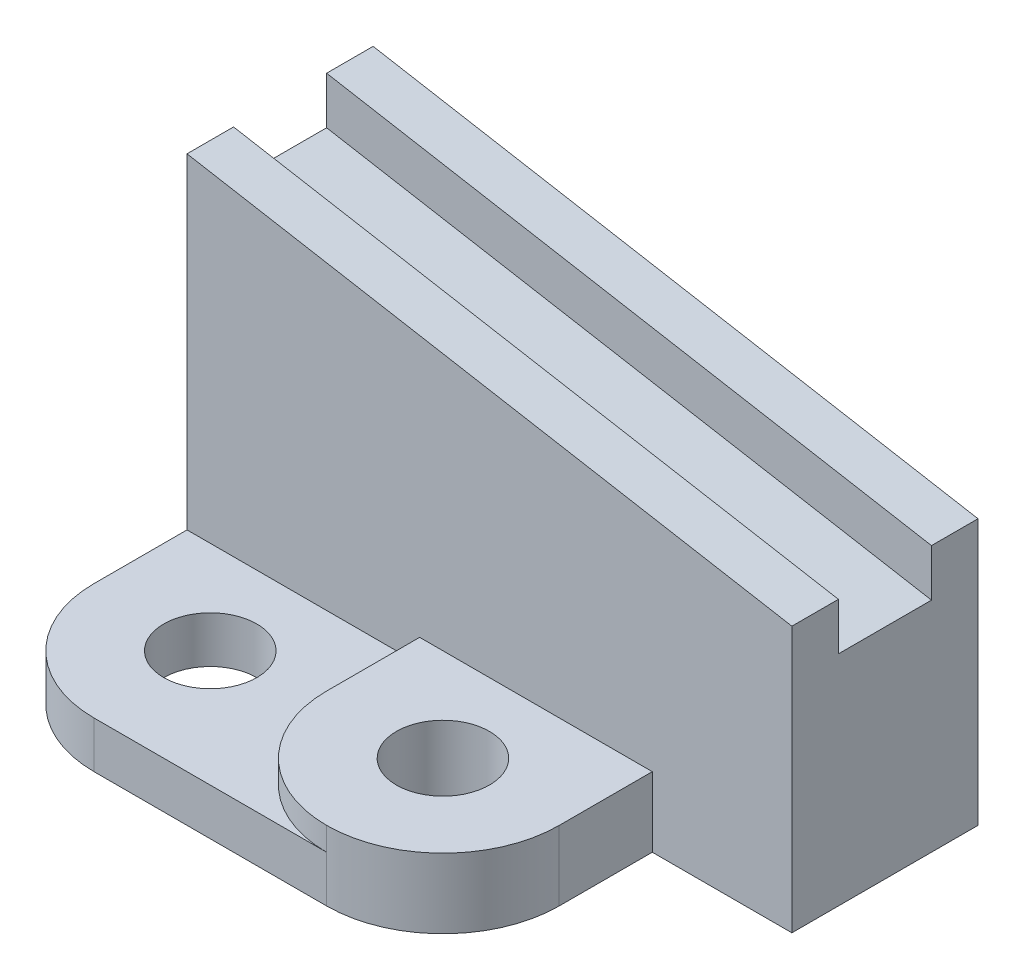
ISO-10303-21;
HEADER;
FILE_DESCRIPTION(('STEP AP214'),'2;1');
FILE_NAME('part.step','',(''),(''),'','','');
FILE_SCHEMA(('AUTOMOTIVE_DESIGN { 1 0 10303 214 1 1 1 1 }'));
ENDSEC;
DATA;
#1=APPLICATION_CONTEXT('core data for automotive mechanical design processes');
#2=APPLICATION_PROTOCOL_DEFINITION('international standard','automotive_design',2000,#1);
#3=PRODUCT_CONTEXT('',#1,'mechanical');
#4=PRODUCT('Part','Part','',(#3));
#5=PRODUCT_RELATED_PRODUCT_CATEGORY('part','',(#4));
#6=PRODUCT_DEFINITION_FORMATION('','',#4);
#7=PRODUCT_DEFINITION_CONTEXT('part definition',#1,'design');
#8=PRODUCT_DEFINITION('design','',#6,#7);
#9=PRODUCT_DEFINITION_SHAPE('','',#8);
#10=(LENGTH_UNIT() NAMED_UNIT(*) SI_UNIT(.MILLI.,.METRE.));
#11=(NAMED_UNIT(*) PLANE_ANGLE_UNIT() SI_UNIT($,.RADIAN.));
#12=(NAMED_UNIT(*) SI_UNIT($,.STERADIAN.) SOLID_ANGLE_UNIT());
#13=UNCERTAINTY_MEASURE_WITH_UNIT(LENGTH_MEASURE(1.E-05),#10,'distance_accuracy_value','');
#14=(GEOMETRIC_REPRESENTATION_CONTEXT(3) GLOBAL_UNCERTAINTY_ASSIGNED_CONTEXT((#13)) GLOBAL_UNIT_ASSIGNED_CONTEXT((#10,
#11,#12)) REPRESENTATION_CONTEXT('',''));
#15=CARTESIAN_POINT('',(0.,0.,0.));
#16=DIRECTION('',(0.,0.,1.));
#17=DIRECTION('',(1.,0.,0.));
#18=AXIS2_PLACEMENT_3D('',#15,#16,#17);
#19=CARTESIAN_POINT('',(-28.2953241603486,9.30078056478405,60.));
#20=DIRECTION('',(0.,1.,0.));
#21=DIRECTION('',(0.,0.,1.));
#22=AXIS2_PLACEMENT_3D('',#19,#20,#21);
#23=CYLINDRICAL_SURFACE('',#22,10.);
#24=CARTESIAN_POINT('',(-28.2953241603486,9.30083056478405,60.));
#25=DIRECTION('',(0.,1.,0.));
#26=DIRECTION('',(0.,0.,1.));
#27=AXIS2_PLACEMENT_3D('',#24,#25,#26);
#28=CIRCLE('',#27,10.);
#29=CARTESIAN_POINT('',(-28.2953241603486,9.30083056478405,70.));
#30=VERTEX_POINT('',#29);
#31=EDGE_CURVE('E176',#30,#30,#28,.T.);
#32=ORIENTED_EDGE('',*,*,#31,.F.);
#33=EDGE_LOOP('',(#32));
#34=FACE_BOUND('',#33,.T.);
#35=CARTESIAN_POINT('',(-28.2953241603486,19.300830564784,60.));
#36=DIRECTION('',(0.,1.,0.));
#37=DIRECTION('',(0.,0.,1.));
#38=AXIS2_PLACEMENT_3D('',#35,#36,#37);
#39=CIRCLE('',#38,10.);
#40=CARTESIAN_POINT('',(-28.2953241603486,19.300830564784,70.));
#41=VERTEX_POINT('',#40);
#42=EDGE_CURVE('E158',#41,#41,#39,.F.);
#43=ORIENTED_EDGE('',*,*,#42,.F.);
#44=EDGE_LOOP('',(#43));
#45=FACE_BOUND('',#44,.T.);
#46=ADVANCED_FACE('F35',(#34,#45),#23,.F.);
#47=CARTESIAN_POINT('',(-28.2953241603486,9.30083056478405,60.));
#48=DIRECTION('',(0.,1.,0.));
#49=DIRECTION('',(0.,0.,1.));
#50=AXIS2_PLACEMENT_3D('',#47,#48,#49);
#51=CYLINDRICAL_SURFACE('',#50,25.);
#52=DIRECTION('',(0.,1.,0.));
#53=VECTOR('',#52,1.);
#54=CARTESIAN_POINT('',(-28.2953241603486,0.,85.));
#55=LINE('',#54,#53);
#56=CARTESIAN_POINT('',(-28.2953241603486,19.300830564784,85.));
#57=VERTEX_POINT('',#56);
#58=CARTESIAN_POINT('',(-28.2953241603486,9.30083056478405,85.));
#59=VERTEX_POINT('',#58);
#60=EDGE_CURVE('E230',#57,#59,#55,.F.);
#61=ORIENTED_EDGE('',*,*,#60,.F.);
#62=CARTESIAN_POINT('',(-28.2953241603486,19.300830564784,60.));
#63=DIRECTION('',(0.,1.,0.));
#64=DIRECTION('',(0.,0.,1.));
#65=AXIS2_PLACEMENT_3D('',#62,#63,#64);
#66=CIRCLE('',#65,25.);
#67=CARTESIAN_POINT('',(-53.2953241603486,19.300830564784,60.));
#68=VERTEX_POINT('',#67);
#69=EDGE_CURVE('E190',#57,#68,#66,.F.);
#70=ORIENTED_EDGE('',*,*,#69,.T.);
#71=DIRECTION('',(0.,1.,0.));
#72=VECTOR('',#71,1.);
#73=CARTESIAN_POINT('',(-53.2953241603486,9.30083056478405,60.));
#74=LINE('',#73,#72);
#75=CARTESIAN_POINT('',(-53.2953241603486,9.30083056478405,60.));
#76=VERTEX_POINT('',#75);
#77=EDGE_CURVE('E227',#76,#68,#74,.T.);
#78=ORIENTED_EDGE('',*,*,#77,.F.);
#79=CARTESIAN_POINT('',(-28.2953241603486,9.30083056478405,60.));
#80=DIRECTION('',(0.,1.,0.));
#81=DIRECTION('',(0.,0.,1.));
#82=AXIS2_PLACEMENT_3D('',#79,#80,#81);
#83=CIRCLE('',#82,25.);
#84=EDGE_CURVE('E231',#59,#76,#83,.F.);
#85=ORIENTED_EDGE('',*,*,#84,.F.);
#86=EDGE_LOOP('',(#61,#70,#78,#85));
#87=FACE_BOUND('',#86,.T.);
#88=ADVANCED_FACE('F240',(#87),#51,.T.);
#89=CARTESIAN_POINT('',(-53.2953241603486,89.3008305647841,40.));
#90=DIRECTION('',(-0.173648177666934,-0.984807753012207,0.));
#91=DIRECTION('',(0.984807753012207,-0.173648177666934,0.));
#92=AXIS2_PLACEMENT_3D('',#89,#90,#91);
#93=PLANE('',#92);
#94=DIRECTION('',(0.,0.,-1.));
#95=VECTOR('',#94,1.);
#96=CARTESIAN_POINT('',(-53.2953241603486,89.3008305647841,40.));
#97=LINE('',#96,#95);
#98=CARTESIAN_POINT('',(-53.2953241603486,89.3008305647841,10.));
#99=VERTEX_POINT('',#98);
#100=CARTESIAN_POINT('',(-53.2953241603486,89.3008305647841,0.));
#101=VERTEX_POINT('',#100);
#102=EDGE_CURVE('E276',#99,#101,#97,.T.);
#103=ORIENTED_EDGE('',*,*,#102,.F.);
#104=DIRECTION('',(0.984807753012207,-0.173648177666934,0.));
#105=VECTOR('',#104,1.);
#106=CARTESIAN_POINT('',(-53.2953241603486,89.3008305647841,10.));
#107=LINE('',#106,#105);
#108=CARTESIAN_POINT('',(76.7046758396514,66.3783230726832,10.));
#109=VERTEX_POINT('',#108);
#110=EDGE_CURVE('E214',#99,#109,#107,.T.);
#111=ORIENTED_EDGE('',*,*,#110,.T.);
#112=DIRECTION('',(0.,0.,-1.));
#113=VECTOR('',#112,1.);
#114=CARTESIAN_POINT('',(76.7046758396514,66.3783230726831,40.));
#115=LINE('',#114,#113);
#116=CARTESIAN_POINT('',(76.7046758396514,66.3783230726831,0.));
#117=VERTEX_POINT('',#116);
#118=EDGE_CURVE('E287',#109,#117,#115,.T.);
#119=ORIENTED_EDGE('',*,*,#118,.T.);
#120=DIRECTION('',(-0.984807753012207,0.173648177666934,0.));
#121=VECTOR('',#120,1.);
#122=CARTESIAN_POINT('',(-53.2953241603486,89.3008305647841,0.));
#123=LINE('',#122,#121);
#124=EDGE_CURVE('E263',#117,#101,#123,.T.);
#125=ORIENTED_EDGE('',*,*,#124,.T.);
#126=EDGE_LOOP('',(#103,#111,#119,#125));
#127=FACE_BOUND('',#126,.T.);
#128=ADVANCED_FACE('F295',(#127),#93,.F.);
#129=CARTESIAN_POINT('',(-53.2953241603486,9.30083056478405,40.));
#130=DIRECTION('',(1.,0.,0.));
#131=DIRECTION('',(0.,0.,-1.));
#132=AXIS2_PLACEMENT_3D('',#129,#130,#131);
#133=PLANE('',#132);
#134=DIRECTION('',(0.,0.,1.));
#135=VECTOR('',#134,1.);
#136=CARTESIAN_POINT('',(-53.2953241603486,19.300830564784,40.));
#137=LINE('',#136,#135);
#138=CARTESIAN_POINT('',(-53.2953241603486,19.300830564784,40.));
#139=VERTEX_POINT('',#138);
#140=EDGE_CURVE('E166',#139,#68,#137,.T.);
#141=ORIENTED_EDGE('',*,*,#140,.F.);
#142=DIRECTION('',(0.,-1.,0.));
#143=VECTOR('',#142,1.);
#144=CARTESIAN_POINT('',(-53.2953241603486,9.30083056478405,40.));
#145=LINE('',#144,#143);
#146=CARTESIAN_POINT('',(-53.2953241603486,89.3008305647841,40.));
#147=VERTEX_POINT('',#146);
#148=EDGE_CURVE('E162',#147,#139,#145,.T.);
#149=ORIENTED_EDGE('',*,*,#148,.F.);
#150=CARTESIAN_POINT('',(-53.2953241603486,89.3008305647841,30.));
#151=VERTEX_POINT('',#150);
#152=EDGE_CURVE('E285',#147,#151,#97,.T.);
#153=ORIENTED_EDGE('',*,*,#152,.T.);
#154=DIRECTION('',(0.,-1.,0.));
#155=VECTOR('',#154,1.);
#156=CARTESIAN_POINT('',(-53.2953241603486,9.30083056478405,30.));
#157=LINE('',#156,#155);
#158=CARTESIAN_POINT('',(-53.2953241603486,79.1465644459266,30.));
#159=VERTEX_POINT('',#158);
#160=EDGE_CURVE('E523',#151,#159,#157,.T.);
#161=ORIENTED_EDGE('',*,*,#160,.T.);
#162=DIRECTION('',(0.,0.,1.));
#163=VECTOR('',#162,1.);
#164=CARTESIAN_POINT('',(-53.2953241603486,79.1465644459266,40.));
#165=LINE('',#164,#163);
#166=CARTESIAN_POINT('',(-53.2953241603486,79.1465644459266,10.));
#167=VERTEX_POINT('',#166);
#168=EDGE_CURVE('E268',#167,#159,#165,.T.);
#169=ORIENTED_EDGE('',*,*,#168,.F.);
#170=DIRECTION('',(0.,1.,0.));
#171=VECTOR('',#170,1.);
#172=CARTESIAN_POINT('',(-53.2953241603486,9.30083056478405,10.));
#173=LINE('',#172,#171);
#174=EDGE_CURVE('E522',#167,#99,#173,.T.);
#175=ORIENTED_EDGE('',*,*,#174,.T.);
#176=ORIENTED_EDGE('',*,*,#102,.T.);
#177=DIRECTION('',(0.,-1.,0.));
#178=VECTOR('',#177,1.);
#179=CARTESIAN_POINT('',(-53.2953241603486,9.30083056478405,0.));
#180=LINE('',#179,#178);
#181=CARTESIAN_POINT('',(-53.2953241603486,9.30083056478405,0.));
#182=VERTEX_POINT('',#181);
#183=EDGE_CURVE('E246',#101,#182,#180,.T.);
#184=ORIENTED_EDGE('',*,*,#183,.T.);
#185=DIRECTION('',(0.,0.,-1.));
#186=VECTOR('',#185,1.);
#187=CARTESIAN_POINT('',(-53.2953241603486,9.30083056478405,40.));
#188=LINE('',#187,#186);
#189=EDGE_CURVE('E244',#76,#182,#188,.T.);
#190=ORIENTED_EDGE('',*,*,#189,.F.);
#191=ORIENTED_EDGE('',*,*,#77,.T.);
#192=EDGE_LOOP('',(#141,#149,#153,#161,#169,#175,#176,#184,#190,#191));
#193=FACE_BOUND('',#192,.T.);
#194=ADVANCED_FACE('F242',(#193),#133,.F.);
#195=CARTESIAN_POINT('',(-53.2953241603486,9.30083056478405,40.));
#196=DIRECTION('',(0.,1.,0.));
#197=DIRECTION('',(0.,0.,1.));
#198=AXIS2_PLACEMENT_3D('',#195,#196,#197);
#199=PLANE('',#198);
#200=CARTESIAN_POINT('',(21.7046758396514,9.30083056478405,60.));
#201=DIRECTION('',(0.,1.,0.));
#202=DIRECTION('',(0.,0.,1.));
#203=AXIS2_PLACEMENT_3D('',#200,#201,#202);
#204=CIRCLE('',#203,10.);
#205=CARTESIAN_POINT('',(21.7046758396514,9.30083056478405,70.));
#206=VERTEX_POINT('',#205);
#207=EDGE_CURVE('E173',#206,#206,#204,.T.);
#208=ORIENTED_EDGE('',*,*,#207,.T.);
#209=EDGE_LOOP('',(#208));
#210=FACE_BOUND('',#209,.T.);
#211=ORIENTED_EDGE('',*,*,#31,.T.);
#212=EDGE_LOOP('',(#211));
#213=FACE_BOUND('',#212,.T.);
#214=DIRECTION('',(1.,0.,0.));
#215=VECTOR('',#214,1.);
#216=CARTESIAN_POINT('',(-53.2953241603486,9.30083056478405,85.));
#217=LINE('',#216,#215);
#218=CARTESIAN_POINT('',(21.7046758396514,9.30083056478405,85.));
#219=VERTEX_POINT('',#218);
#220=EDGE_CURVE('E180',#59,#219,#217,.T.);
#221=ORIENTED_EDGE('',*,*,#220,.F.);
#222=ORIENTED_EDGE('',*,*,#84,.T.);
#223=ORIENTED_EDGE('',*,*,#189,.T.);
#224=DIRECTION('',(1.,0.,0.));
#225=VECTOR('',#224,1.);
#226=CARTESIAN_POINT('',(-53.2953241603486,9.30083056478405,0.));
#227=LINE('',#226,#225);
#228=CARTESIAN_POINT('',(76.7046758396514,9.30083056478405,0.));
#229=VERTEX_POINT('',#228);
#230=EDGE_CURVE('E278',#182,#229,#227,.T.);
#231=ORIENTED_EDGE('',*,*,#230,.T.);
#232=DIRECTION('',(0.,0.,-1.));
#233=VECTOR('',#232,1.);
#234=CARTESIAN_POINT('',(76.7046758396514,9.30083056478405,40.));
#235=LINE('',#234,#233);
#236=CARTESIAN_POINT('',(76.7046758396514,9.30083056478405,40.));
#237=VERTEX_POINT('',#236);
#238=EDGE_CURVE('E249',#237,#229,#235,.T.);
#239=ORIENTED_EDGE('',*,*,#238,.F.);
#240=DIRECTION('',(1.,0.,0.));
#241=VECTOR('',#240,1.);
#242=CARTESIAN_POINT('',(-53.2953241603486,9.30083056478405,40.));
#243=LINE('',#242,#241);
#244=CARTESIAN_POINT('',(46.7046758396514,9.30083056478405,40.));
#245=VERTEX_POINT('',#244);
#246=EDGE_CURVE('E262',#245,#237,#243,.T.);
#247=ORIENTED_EDGE('',*,*,#246,.F.);
#248=DIRECTION('',(0.,0.,-1.));
#249=VECTOR('',#248,1.);
#250=CARTESIAN_POINT('',(46.7046758396514,9.30083056478405,85.));
#251=LINE('',#250,#249);
#252=CARTESIAN_POINT('',(46.7046758396514,9.30083056478405,60.));
#253=VERTEX_POINT('',#252);
#254=EDGE_CURVE('E220',#253,#245,#251,.T.);
#255=ORIENTED_EDGE('',*,*,#254,.F.);
#256=CARTESIAN_POINT('',(21.7046758396514,9.30083056478405,60.));
#257=DIRECTION('',(0.,1.,0.));
#258=DIRECTION('',(0.,0.,1.));
#259=AXIS2_PLACEMENT_3D('',#256,#257,#258);
#260=CIRCLE('',#259,25.);
#261=EDGE_CURVE('E224',#253,#219,#260,.F.);
#262=ORIENTED_EDGE('',*,*,#261,.T.);
#263=EDGE_LOOP('',(#221,#222,#223,#231,#239,#247,#255,#262));
#264=FACE_BOUND('',#263,.T.);
#265=ADVANCED_FACE('F305',(#210,#213,#264),#199,.F.);
#266=CARTESIAN_POINT('',(76.7046758396514,9.30083056478405,40.));
#267=DIRECTION('',(-1.,0.,0.));
#268=DIRECTION('',(0.,-1.,0.));
#269=AXIS2_PLACEMENT_3D('',#266,#267,#268);
#270=PLANE('',#269);
#271=ORIENTED_EDGE('',*,*,#118,.F.);
#272=DIRECTION('',(0.,-1.,0.));
#273=VECTOR('',#272,1.);
#274=CARTESIAN_POINT('',(76.7046758396514,9.30083056478405,10.));
#275=LINE('',#274,#273);
#276=CARTESIAN_POINT('',(76.7046758396514,56.2240569538257,10.));
#277=VERTEX_POINT('',#276);
#278=EDGE_CURVE('E525',#109,#277,#275,.T.);
#279=ORIENTED_EDGE('',*,*,#278,.T.);
#280=DIRECTION('',(0.,0.,-1.));
#281=VECTOR('',#280,1.);
#282=CARTESIAN_POINT('',(76.7046758396514,56.2240569538257,40.));
#283=LINE('',#282,#281);
#284=CARTESIAN_POINT('',(76.7046758396514,56.2240569538257,30.));
#285=VERTEX_POINT('',#284);
#286=EDGE_CURVE('E212',#285,#277,#283,.T.);
#287=ORIENTED_EDGE('',*,*,#286,.F.);
#288=DIRECTION('',(0.,1.,0.));
#289=VECTOR('',#288,1.);
#290=CARTESIAN_POINT('',(76.7046758396514,9.30083056478405,30.));
#291=LINE('',#290,#289);
#292=CARTESIAN_POINT('',(76.7046758396514,66.3783230726832,30.));
#293=VERTEX_POINT('',#292);
#294=EDGE_CURVE('E524',#285,#293,#291,.T.);
#295=ORIENTED_EDGE('',*,*,#294,.T.);
#296=CARTESIAN_POINT('',(76.7046758396514,66.3783230726831,40.));
#297=VERTEX_POINT('',#296);
#298=EDGE_CURVE('E254',#297,#293,#115,.T.);
#299=ORIENTED_EDGE('',*,*,#298,.F.);
#300=DIRECTION('',(0.,1.,0.));
#301=VECTOR('',#300,1.);
#302=CARTESIAN_POINT('',(76.7046758396514,9.30083056478405,40.));
#303=LINE('',#302,#301);
#304=EDGE_CURVE('E272',#237,#297,#303,.T.);
#305=ORIENTED_EDGE('',*,*,#304,.F.);
#306=ORIENTED_EDGE('',*,*,#238,.T.);
#307=DIRECTION('',(0.,1.,0.));
#308=VECTOR('',#307,1.);
#309=CARTESIAN_POINT('',(76.7046758396514,9.30083056478405,0.));
#310=LINE('',#309,#308);
#311=EDGE_CURVE('E280',#229,#117,#310,.T.);
#312=ORIENTED_EDGE('',*,*,#311,.T.);
#313=EDGE_LOOP('',(#271,#279,#287,#295,#299,#305,#306,#312));
#314=FACE_BOUND('',#313,.T.);
#315=ADVANCED_FACE('F300',(#314),#270,.F.);
#316=ORIENTED_EDGE('',*,*,#298,.T.);
#317=DIRECTION('',(-0.984807753012207,0.173648177666934,0.));
#318=VECTOR('',#317,1.);
#319=CARTESIAN_POINT('',(-53.2953241603486,89.3008305647841,30.));
#320=LINE('',#319,#318);
#321=EDGE_CURVE('E248',#293,#151,#320,.T.);
#322=ORIENTED_EDGE('',*,*,#321,.T.);
#323=ORIENTED_EDGE('',*,*,#152,.F.);
#324=DIRECTION('',(-0.984807753012207,0.173648177666934,0.));
#325=VECTOR('',#324,1.);
#326=CARTESIAN_POINT('',(-53.2953241603486,89.3008305647841,40.));
#327=LINE('',#326,#325);
#328=EDGE_CURVE('E274',#297,#147,#327,.T.);
#329=ORIENTED_EDGE('',*,*,#328,.F.);
#330=EDGE_LOOP('',(#316,#322,#323,#329));
#331=FACE_BOUND('',#330,.T.);
#332=ADVANCED_FACE('F355',(#331),#93,.F.);
#333=CARTESIAN_POINT('',(0.,0.,40.));
#334=DIRECTION('',(0.,0.,-1.));
#335=DIRECTION('',(-1.,0.,0.));
#336=AXIS2_PLACEMENT_3D('',#333,#334,#335);
#337=PLANE('',#336);
#338=ORIENTED_EDGE('',*,*,#148,.T.);
#339=DIRECTION('',(-1.,0.,0.));
#340=VECTOR('',#339,1.);
#341=CARTESIAN_POINT('',(-53.2953241603486,19.300830564784,40.));
#342=LINE('',#341,#340);
#343=CARTESIAN_POINT('',(-3.29532416034857,19.300830564784,40.));
#344=VERTEX_POINT('',#343);
#345=EDGE_CURVE('E145',#344,#139,#342,.T.);
#346=ORIENTED_EDGE('',*,*,#345,.F.);
#347=DIRECTION('',(0.,1.,0.));
#348=VECTOR('',#347,1.);
#349=CARTESIAN_POINT('',(-3.29532416034857,19.300830564784,40.));
#350=LINE('',#349,#348);
#351=CARTESIAN_POINT('',(-3.29532416034857,24.3008305647841,40.));
#352=VERTEX_POINT('',#351);
#353=EDGE_CURVE('E152',#344,#352,#350,.T.);
#354=ORIENTED_EDGE('',*,*,#353,.T.);
#355=DIRECTION('',(1.,0.,0.));
#356=VECTOR('',#355,1.);
#357=CARTESIAN_POINT('',(-53.2953241603486,24.3008305647841,40.));
#358=LINE('',#357,#356);
#359=CARTESIAN_POINT('',(46.7046758396514,24.3008305647841,40.));
#360=VERTEX_POINT('',#359);
#361=EDGE_CURVE('E179',#352,#360,#358,.T.);
#362=ORIENTED_EDGE('',*,*,#361,.T.);
#363=DIRECTION('',(0.,1.,0.));
#364=VECTOR('',#363,1.);
#365=CARTESIAN_POINT('',(46.7046758396514,9.30083056478405,40.));
#366=LINE('',#365,#364);
#367=EDGE_CURVE('E183',#245,#360,#366,.T.);
#368=ORIENTED_EDGE('',*,*,#367,.F.);
#369=ORIENTED_EDGE('',*,*,#246,.T.);
#370=ORIENTED_EDGE('',*,*,#304,.T.);
#371=ORIENTED_EDGE('',*,*,#328,.T.);
#372=EDGE_LOOP('',(#338,#346,#354,#362,#368,#369,#370,#371));
#373=FACE_BOUND('',#372,.T.);
#374=ADVANCED_FACE('F160',(#373),#337,.F.);
#375=CARTESIAN_POINT('',(0.,0.,0.));
#376=DIRECTION('',(0.,0.,-1.));
#377=DIRECTION('',(-1.,0.,0.));
#378=AXIS2_PLACEMENT_3D('',#375,#376,#377);
#379=PLANE('',#378);
#380=ORIENTED_EDGE('',*,*,#183,.F.);
#381=ORIENTED_EDGE('',*,*,#124,.F.);
#382=ORIENTED_EDGE('',*,*,#311,.F.);
#383=ORIENTED_EDGE('',*,*,#230,.F.);
#384=EDGE_LOOP('',(#380,#381,#382,#383));
#385=FACE_BOUND('',#384,.T.);
#386=ADVANCED_FACE('F304',(#385),#379,.T.);
#387=CARTESIAN_POINT('',(11.9278089955272,67.6459663042046,0.));
#388=DIRECTION('',(0.173648177666934,0.984807753012207,0.));
#389=DIRECTION('',(-0.984807753012207,0.173648177666934,0.));
#390=AXIS2_PLACEMENT_3D('',#387,#388,#389);
#391=PLANE('',#390);
#392=ORIENTED_EDGE('',*,*,#168,.T.);
#393=DIRECTION('',(0.984807753012207,-0.173648177666934,0.));
#394=VECTOR('',#393,1.);
#395=CARTESIAN_POINT('',(-64.2804937512554,81.0835462324617,30.));
#396=LINE('',#395,#394);
#397=EDGE_CURVE('E222',#159,#285,#396,.T.);
#398=ORIENTED_EDGE('',*,*,#397,.T.);
#399=ORIENTED_EDGE('',*,*,#286,.T.);
#400=DIRECTION('',(-0.984807753012207,0.173648177666934,0.));
#401=VECTOR('',#400,1.);
#402=CARTESIAN_POINT('',(-64.2804937512554,81.0835462324617,10.));
#403=LINE('',#402,#401);
#404=EDGE_CURVE('E519',#277,#167,#403,.T.);
#405=ORIENTED_EDGE('',*,*,#404,.T.);
#406=EDGE_LOOP('',(#392,#398,#399,#405));
#407=FACE_BOUND('',#406,.T.);
#408=ADVANCED_FACE('F360',(#407),#391,.T.);
#409=CARTESIAN_POINT('',(-64.2804937512554,81.0835462324617,10.));
#410=DIRECTION('',(0.,0.,-1.));
#411=DIRECTION('',(-1.,0.,0.));
#412=AXIS2_PLACEMENT_3D('',#409,#410,#411);
#413=PLANE('',#412);
#414=ORIENTED_EDGE('',*,*,#404,.F.);
#415=ORIENTED_EDGE('',*,*,#278,.F.);
#416=ORIENTED_EDGE('',*,*,#110,.F.);
#417=ORIENTED_EDGE('',*,*,#174,.F.);
#418=EDGE_LOOP('',(#414,#415,#416,#417));
#419=FACE_BOUND('',#418,.T.);
#420=ADVANCED_FACE('F366',(#419),#413,.F.);
#421=CARTESIAN_POINT('',(-64.2804937512554,81.0835462324617,30.));
#422=DIRECTION('',(0.,0.,1.));
#423=DIRECTION('',(1.,0.,0.));
#424=AXIS2_PLACEMENT_3D('',#421,#422,#423);
#425=PLANE('',#424);
#426=ORIENTED_EDGE('',*,*,#321,.F.);
#427=ORIENTED_EDGE('',*,*,#294,.F.);
#428=ORIENTED_EDGE('',*,*,#397,.F.);
#429=ORIENTED_EDGE('',*,*,#160,.F.);
#430=EDGE_LOOP('',(#426,#427,#428,#429));
#431=FACE_BOUND('',#430,.T.);
#432=ADVANCED_FACE('F363',(#431),#425,.F.);
#433=CARTESIAN_POINT('',(46.7046758396514,9.30083056478405,85.));
#434=DIRECTION('',(-1.,0.,0.));
#435=DIRECTION('',(0.,0.,1.));
#436=AXIS2_PLACEMENT_3D('',#433,#434,#435);
#437=PLANE('',#436);
#438=DIRECTION('',(0.,0.,-1.));
#439=VECTOR('',#438,1.);
#440=CARTESIAN_POINT('',(46.7046758396514,24.3008305647841,85.));
#441=LINE('',#440,#439);
#442=CARTESIAN_POINT('',(46.7046758396514,24.3008305647841,60.));
#443=VERTEX_POINT('',#442);
#444=EDGE_CURVE('E182',#443,#360,#441,.T.);
#445=ORIENTED_EDGE('',*,*,#444,.F.);
#446=DIRECTION('',(0.,1.,0.));
#447=VECTOR('',#446,1.);
#448=CARTESIAN_POINT('',(46.7046758396514,9.30083056478405,60.));
#449=LINE('',#448,#447);
#450=EDGE_CURVE('E209',#443,#253,#449,.F.);
#451=ORIENTED_EDGE('',*,*,#450,.T.);
#452=ORIENTED_EDGE('',*,*,#254,.T.);
#453=ORIENTED_EDGE('',*,*,#367,.T.);
#454=EDGE_LOOP('',(#445,#451,#452,#453));
#455=FACE_BOUND('',#454,.T.);
#456=ADVANCED_FACE('F314',(#455),#437,.F.);
#457=CARTESIAN_POINT('',(-53.2953241603486,24.3008305647841,85.));
#458=DIRECTION('',(0.,1.,0.));
#459=DIRECTION('',(0.,0.,1.));
#460=AXIS2_PLACEMENT_3D('',#457,#458,#459);
#461=PLANE('',#460);
#462=DIRECTION('',(0.,0.,-1.));
#463=VECTOR('',#462,1.);
#464=CARTESIAN_POINT('',(-3.29532416034857,24.3008305647841,40.));
#465=LINE('',#464,#463);
#466=CARTESIAN_POINT('',(-3.29532416034857,24.3008305647841,60.));
#467=VERTEX_POINT('',#466);
#468=EDGE_CURVE('E155',#467,#352,#465,.T.);
#469=ORIENTED_EDGE('',*,*,#468,.F.);
#470=CARTESIAN_POINT('',(21.7046758396514,24.3008305647841,60.));
#471=DIRECTION('',(0.,1.,0.));
#472=DIRECTION('',(0.,0.,1.));
#473=AXIS2_PLACEMENT_3D('',#470,#471,#472);
#474=CIRCLE('',#473,25.);
#475=CARTESIAN_POINT('',(21.7046758396514,24.3008305647841,85.));
#476=VERTEX_POINT('',#475);
#477=EDGE_CURVE('E43',#467,#476,#474,.T.);
#478=ORIENTED_EDGE('',*,*,#477,.T.);
#479=CARTESIAN_POINT('',(21.7046758396514,24.3008305647841,60.));
#480=DIRECTION('',(0.,1.,0.));
#481=DIRECTION('',(0.,0.,1.));
#482=AXIS2_PLACEMENT_3D('',#479,#480,#481);
#483=CIRCLE('',#482,25.);
#484=EDGE_CURVE('E198',#476,#443,#483,.T.);
#485=ORIENTED_EDGE('',*,*,#484,.T.);
#486=ORIENTED_EDGE('',*,*,#444,.T.);
#487=ORIENTED_EDGE('',*,*,#361,.F.);
#488=EDGE_LOOP('',(#469,#478,#485,#486,#487));
#489=FACE_BOUND('',#488,.T.);
#490=CARTESIAN_POINT('',(21.7046758396514,24.3008305647841,60.));
#491=DIRECTION('',(0.,1.,0.));
#492=DIRECTION('',(0.,0.,1.));
#493=AXIS2_PLACEMENT_3D('',#490,#491,#492);
#494=CIRCLE('',#493,10.);
#495=CARTESIAN_POINT('',(21.7046758396514,24.3008305647841,70.));
#496=VERTEX_POINT('',#495);
#497=EDGE_CURVE('E170',#496,#496,#494,.T.);
#498=ORIENTED_EDGE('',*,*,#497,.F.);
#499=EDGE_LOOP('',(#498));
#500=FACE_BOUND('',#499,.T.);
#501=ADVANCED_FACE('F195',(#489,#500),#461,.T.);
#502=CARTESIAN_POINT('',(0.,0.,85.));
#503=DIRECTION('',(0.,0.,-1.));
#504=DIRECTION('',(-1.,0.,0.));
#505=AXIS2_PLACEMENT_3D('',#502,#503,#504);
#506=PLANE('',#505);
#507=DIRECTION('',(0.,1.,0.));
#508=VECTOR('',#507,1.);
#509=CARTESIAN_POINT('',(21.7046758396514,0.,85.));
#510=LINE('',#509,#508);
#511=CARTESIAN_POINT('',(21.7046758396514,19.300830564784,85.));
#512=VERTEX_POINT('',#511);
#513=EDGE_CURVE('E210',#219,#512,#510,.T.);
#514=ORIENTED_EDGE('',*,*,#513,.T.);
#515=DIRECTION('',(1.,0.,0.));
#516=VECTOR('',#515,1.);
#517=CARTESIAN_POINT('',(-53.2953241603486,19.300830564784,85.));
#518=LINE('',#517,#516);
#519=EDGE_CURVE('E49',#57,#512,#518,.T.);
#520=ORIENTED_EDGE('',*,*,#519,.F.);
#521=ORIENTED_EDGE('',*,*,#60,.T.);
#522=ORIENTED_EDGE('',*,*,#220,.T.);
#523=EDGE_LOOP('',(#514,#520,#521,#522));
#524=FACE_BOUND('',#523,.T.);
#525=ADVANCED_FACE('F316',(#524),#506,.F.);
#526=CARTESIAN_POINT('',(21.7046758396514,9.30078056478405,60.));
#527=DIRECTION('',(0.,1.,0.));
#528=DIRECTION('',(0.,0.,1.));
#529=AXIS2_PLACEMENT_3D('',#526,#527,#528);
#530=CYLINDRICAL_SURFACE('',#529,10.);
#531=ORIENTED_EDGE('',*,*,#497,.T.);
#532=EDGE_LOOP('',(#531));
#533=FACE_BOUND('',#532,.T.);
#534=ORIENTED_EDGE('',*,*,#207,.F.);
#535=EDGE_LOOP('',(#534));
#536=FACE_BOUND('',#535,.T.);
#537=ADVANCED_FACE('F319',(#533,#536),#530,.F.);
#538=CARTESIAN_POINT('',(21.7046758396514,0.,60.));
#539=DIRECTION('',(0.,1.,0.));
#540=DIRECTION('',(0.,0.,1.));
#541=AXIS2_PLACEMENT_3D('',#538,#539,#540);
#542=CYLINDRICAL_SURFACE('',#541,25.);
#543=ORIENTED_EDGE('',*,*,#261,.F.);
#544=ORIENTED_EDGE('',*,*,#450,.F.);
#545=ORIENTED_EDGE('',*,*,#484,.F.);
#546=EDGE_CURVE('E207',#512,#476,#510,.T.);
#547=ORIENTED_EDGE('',*,*,#546,.F.);
#548=ORIENTED_EDGE('',*,*,#513,.F.);
#549=EDGE_LOOP('',(#543,#544,#545,#547,#548));
#550=FACE_BOUND('',#549,.T.);
#551=ADVANCED_FACE('F205',(#550),#542,.T.);
#552=CARTESIAN_POINT('',(0.,19.300830564784,0.));
#553=DIRECTION('',(0.,1.,0.));
#554=DIRECTION('',(0.,0.,1.));
#555=AXIS2_PLACEMENT_3D('',#552,#553,#554);
#556=PLANE('',#555);
#557=ORIENTED_EDGE('',*,*,#519,.T.);
#558=CARTESIAN_POINT('',(21.7046758396514,19.300830564784,60.));
#559=DIRECTION('',(0.,1.,0.));
#560=DIRECTION('',(0.,0.,1.));
#561=AXIS2_PLACEMENT_3D('',#558,#559,#560);
#562=CIRCLE('',#561,25.);
#563=CARTESIAN_POINT('',(-3.29532416034857,19.300830564784,60.));
#564=VERTEX_POINT('',#563);
#565=EDGE_CURVE('E11',#512,#564,#562,.F.);
#566=ORIENTED_EDGE('',*,*,#565,.T.);
#567=DIRECTION('',(0.,0.,-1.));
#568=VECTOR('',#567,1.);
#569=CARTESIAN_POINT('',(-3.29532416034857,19.300830564784,40.));
#570=LINE('',#569,#568);
#571=EDGE_CURVE('E140',#564,#344,#570,.T.);
#572=ORIENTED_EDGE('',*,*,#571,.T.);
#573=ORIENTED_EDGE('',*,*,#345,.T.);
#574=ORIENTED_EDGE('',*,*,#140,.T.);
#575=ORIENTED_EDGE('',*,*,#69,.F.);
#576=EDGE_LOOP('',(#557,#566,#572,#573,#574,#575));
#577=FACE_BOUND('',#576,.T.);
#578=ORIENTED_EDGE('',*,*,#42,.T.);
#579=EDGE_LOOP('',(#578));
#580=FACE_BOUND('',#579,.T.);
#581=ADVANCED_FACE('F142',(#577,#580),#556,.T.);
#582=CARTESIAN_POINT('',(-3.29532416034857,19.300830564784,40.));
#583=DIRECTION('',(1.,0.,0.));
#584=DIRECTION('',(0.,0.,-1.));
#585=AXIS2_PLACEMENT_3D('',#582,#583,#584);
#586=PLANE('',#585);
#587=ORIENTED_EDGE('',*,*,#571,.F.);
#588=DIRECTION('',(0.,1.,0.));
#589=VECTOR('',#588,1.);
#590=CARTESIAN_POINT('',(-3.29532416034857,19.300830564784,60.));
#591=LINE('',#590,#589);
#592=EDGE_CURVE('E192',#564,#467,#591,.T.);
#593=ORIENTED_EDGE('',*,*,#592,.T.);
#594=ORIENTED_EDGE('',*,*,#468,.T.);
#595=ORIENTED_EDGE('',*,*,#353,.F.);
#596=EDGE_LOOP('',(#587,#593,#594,#595));
#597=FACE_BOUND('',#596,.T.);
#598=ADVANCED_FACE('F153',(#597),#586,.F.);
#599=CARTESIAN_POINT('',(21.7046758396514,19.300830564784,60.));
#600=DIRECTION('',(0.,1.,0.));
#601=DIRECTION('',(0.,0.,1.));
#602=AXIS2_PLACEMENT_3D('',#599,#600,#601);
#603=CYLINDRICAL_SURFACE('',#602,25.);
#604=ORIENTED_EDGE('',*,*,#565,.F.);
#605=ORIENTED_EDGE('',*,*,#546,.T.);
#606=ORIENTED_EDGE('',*,*,#477,.F.);
#607=ORIENTED_EDGE('',*,*,#592,.F.);
#608=EDGE_LOOP('',(#604,#605,#606,#607));
#609=FACE_BOUND('',#608,.T.);
#610=ADVANCED_FACE('F37',(#609),#603,.T.);
#611=CLOSED_SHELL('',(#46,#88,#128,#194,#265,#315,#332,#374,#386,#408,#420,#432,#456,#501,#525,
#537,#551,#581,#598,#610));
#612=MANIFOLD_SOLID_BREP('B2',#611);
#613=ADVANCED_BREP_SHAPE_REPRESENTATION('',(#18,#612),#14);
#614=SHAPE_DEFINITION_REPRESENTATION(#9,#613);
ENDSEC;
END-ISO-10303-21;
